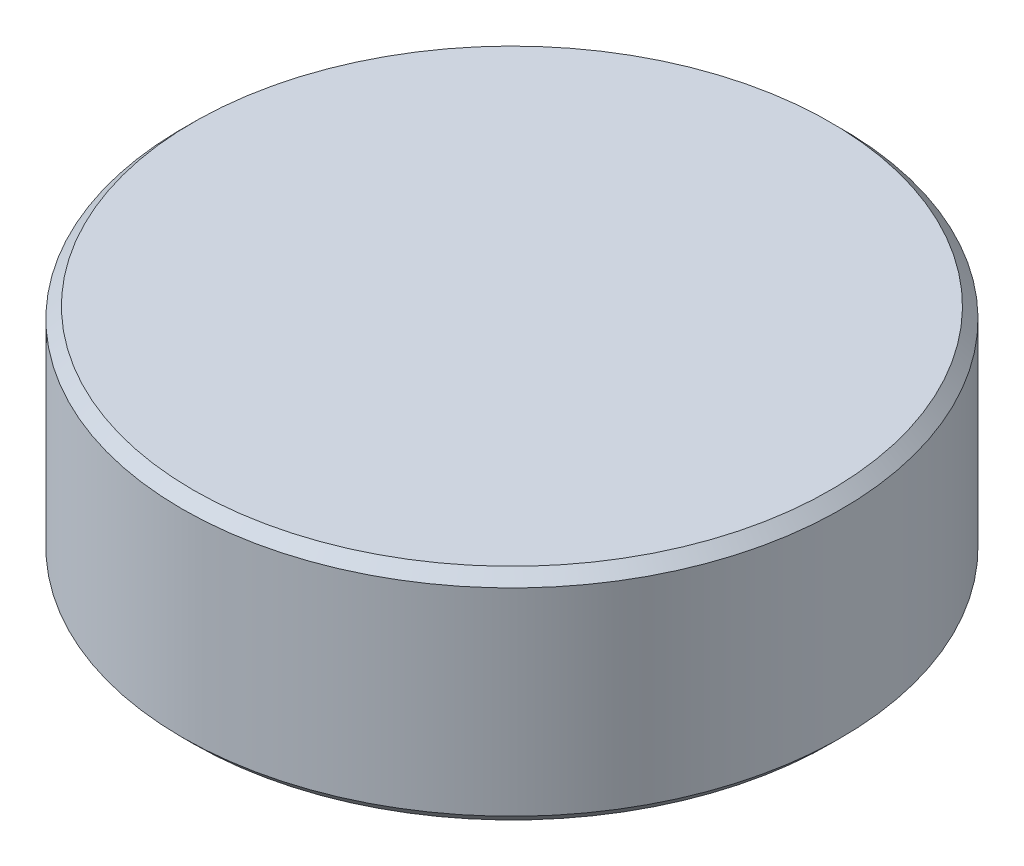
ISO-10303-21;
HEADER;
FILE_DESCRIPTION(('STEP AP214'),'2;1');
FILE_NAME('part.step','',(''),(''),'','','');
FILE_SCHEMA(('AUTOMOTIVE_DESIGN { 1 0 10303 214 1 1 1 1 }'));
ENDSEC;
DATA;
#1=APPLICATION_CONTEXT('core data for automotive mechanical design processes');
#2=APPLICATION_PROTOCOL_DEFINITION('international standard','automotive_design',2000,#1);
#3=PRODUCT_CONTEXT('',#1,'mechanical');
#4=PRODUCT('Part','Part','',(#3));
#5=PRODUCT_RELATED_PRODUCT_CATEGORY('part','',(#4));
#6=PRODUCT_DEFINITION_FORMATION('','',#4);
#7=PRODUCT_DEFINITION_CONTEXT('part definition',#1,'design');
#8=PRODUCT_DEFINITION('design','',#6,#7);
#9=PRODUCT_DEFINITION_SHAPE('','',#8);
#10=(LENGTH_UNIT() NAMED_UNIT(*) SI_UNIT(.MILLI.,.METRE.));
#11=(NAMED_UNIT(*) PLANE_ANGLE_UNIT() SI_UNIT($,.RADIAN.));
#12=(NAMED_UNIT(*) SI_UNIT($,.STERADIAN.) SOLID_ANGLE_UNIT());
#13=UNCERTAINTY_MEASURE_WITH_UNIT(LENGTH_MEASURE(1.E-05),#10,'distance_accuracy_value','');
#14=(GEOMETRIC_REPRESENTATION_CONTEXT(3) GLOBAL_UNCERTAINTY_ASSIGNED_CONTEXT((#13)) GLOBAL_UNIT_ASSIGNED_CONTEXT((#10,
#11,#12)) REPRESENTATION_CONTEXT('',''));
#15=CARTESIAN_POINT('',(0.,0.,0.));
#16=DIRECTION('',(0.,0.,1.));
#17=DIRECTION('',(1.,0.,0.));
#18=AXIS2_PLACEMENT_3D('',#15,#16,#17);
#19=CARTESIAN_POINT('',(0.,2.,0.));
#20=DIRECTION('',(0.,-1.,0.));
#21=DIRECTION('',(0.,0.,-1.));
#22=AXIS2_PLACEMENT_3D('',#19,#20,#21);
#23=CYLINDRICAL_SURFACE('',#22,3.);
#24=CARTESIAN_POINT('',(0.,0.0999999999999994,0.));
#25=DIRECTION('',(0.,1.,0.));
#26=DIRECTION('',(0.,0.,1.));
#27=AXIS2_PLACEMENT_3D('',#24,#25,#26);
#28=CIRCLE('',#27,3.);
#29=CARTESIAN_POINT('',(0.,0.0999999999999994,3.));
#30=VERTEX_POINT('',#29);
#31=EDGE_CURVE('E44',#30,#30,#28,.T.);
#32=ORIENTED_EDGE('',*,*,#31,.T.);
#33=EDGE_LOOP('',(#32));
#34=FACE_BOUND('',#33,.T.);
#35=CARTESIAN_POINT('',(0.,1.9,0.));
#36=DIRECTION('',(0.,1.,0.));
#37=DIRECTION('',(0.,0.,1.));
#38=AXIS2_PLACEMENT_3D('',#35,#36,#37);
#39=CIRCLE('',#38,3.);
#40=CARTESIAN_POINT('',(0.,1.9,3.));
#41=VERTEX_POINT('',#40);
#42=EDGE_CURVE('E48',#41,#41,#39,.F.);
#43=ORIENTED_EDGE('',*,*,#42,.T.);
#44=EDGE_LOOP('',(#43));
#45=FACE_BOUND('',#44,.T.);
#46=ADVANCED_FACE('F33',(#34,#45),#23,.T.);
#47=CARTESIAN_POINT('',(0.,2.,0.));
#48=DIRECTION('',(0.,1.,0.));
#49=DIRECTION('',(0.,0.,1.));
#50=AXIS2_PLACEMENT_3D('',#47,#48,#49);
#51=PLANE('',#50);
#52=CARTESIAN_POINT('',(0.,2.,0.));
#53=DIRECTION('',(0.,1.,0.));
#54=DIRECTION('',(0.,0.,1.));
#55=AXIS2_PLACEMENT_3D('',#52,#53,#54);
#56=CIRCLE('',#55,2.9);
#57=CARTESIAN_POINT('',(0.,2.,2.9));
#58=VERTEX_POINT('',#57);
#59=EDGE_CURVE('E10',#58,#58,#56,.T.);
#60=ORIENTED_EDGE('',*,*,#59,.T.);
#61=EDGE_LOOP('',(#60));
#62=FACE_BOUND('',#61,.T.);
#63=ADVANCED_FACE('F64',(#62),#51,.T.);
#64=CARTESIAN_POINT('',(0.,0.,0.));
#65=DIRECTION('',(0.,1.,0.));
#66=DIRECTION('',(0.,0.,1.));
#67=AXIS2_PLACEMENT_3D('',#64,#65,#66);
#68=PLANE('',#67);
#69=CARTESIAN_POINT('',(0.,0.,0.));
#70=DIRECTION('',(0.,1.,0.));
#71=DIRECTION('',(0.,0.,1.));
#72=AXIS2_PLACEMENT_3D('',#69,#70,#71);
#73=CIRCLE('',#72,2.9);
#74=CARTESIAN_POINT('',(0.,0.,2.9));
#75=VERTEX_POINT('',#74);
#76=EDGE_CURVE('E40',#75,#75,#73,.F.);
#77=ORIENTED_EDGE('',*,*,#76,.T.);
#78=EDGE_LOOP('',(#77));
#79=FACE_BOUND('',#78,.T.);
#80=ADVANCED_FACE('F61',(#79),#68,.F.);
#81=CARTESIAN_POINT('',(0.,0.0999999999999994,0.));
#82=DIRECTION('',(0.,1.,0.));
#83=DIRECTION('',(0.,0.,1.));
#84=AXIS2_PLACEMENT_3D('',#81,#82,#83);
#85=CONICAL_SURFACE('',#84,3.,0.785398163397453);
#86=ORIENTED_EDGE('',*,*,#76,.F.);
#87=EDGE_LOOP('',(#86));
#88=FACE_BOUND('',#87,.T.);
#89=ORIENTED_EDGE('',*,*,#31,.F.);
#90=EDGE_LOOP('',(#89));
#91=FACE_BOUND('',#90,.T.);
#92=ADVANCED_FACE('F57',(#88,#91),#85,.T.);
#93=CARTESIAN_POINT('',(0.,2.,0.));
#94=DIRECTION('',(0.,-1.,0.));
#95=DIRECTION('',(0.,0.,-1.));
#96=AXIS2_PLACEMENT_3D('',#93,#94,#95);
#97=CONICAL_SURFACE('',#96,2.9,0.785398163397446);
#98=ORIENTED_EDGE('',*,*,#42,.F.);
#99=EDGE_LOOP('',(#98));
#100=FACE_BOUND('',#99,.T.);
#101=ORIENTED_EDGE('',*,*,#59,.F.);
#102=EDGE_LOOP('',(#101));
#103=FACE_BOUND('',#102,.T.);
#104=ADVANCED_FACE('F35',(#100,#103),#97,.T.);
#105=CLOSED_SHELL('',(#46,#63,#80,#92,#104));
#106=MANIFOLD_SOLID_BREP('B2',#105);
#107=ADVANCED_BREP_SHAPE_REPRESENTATION('',(#18,#106),#14);
#108=SHAPE_DEFINITION_REPRESENTATION(#9,#107);
ENDSEC;
END-ISO-10303-21;
